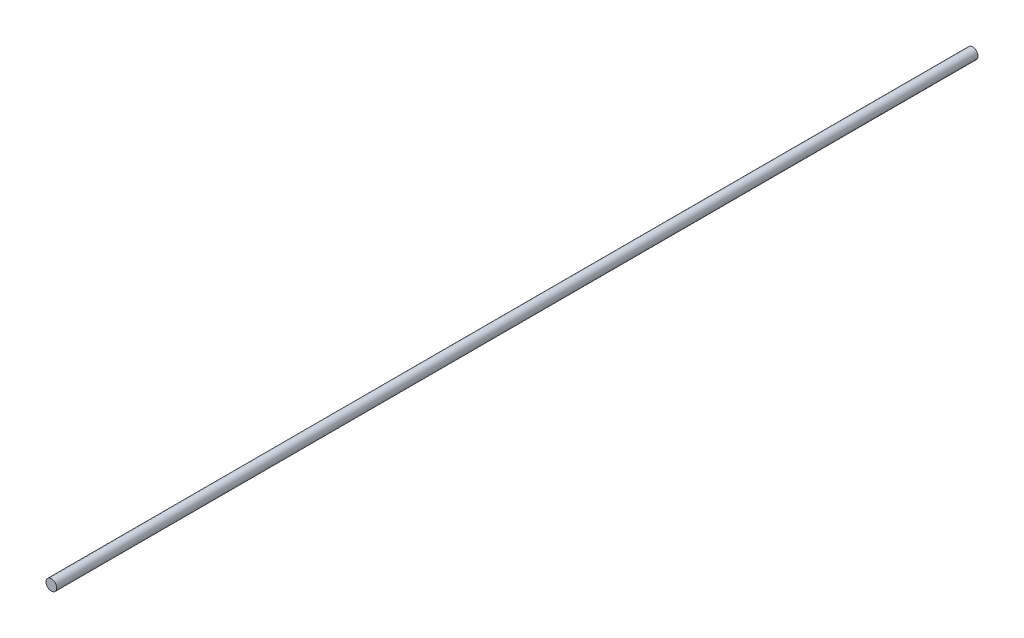
ISO-10303-21;
HEADER;
FILE_DESCRIPTION(('STEP AP214'),'2;1');
FILE_NAME('part.step','',(''),(''),'','','');
FILE_SCHEMA(('AUTOMOTIVE_DESIGN { 1 0 10303 214 1 1 1 1 }'));
ENDSEC;
DATA;
#1=APPLICATION_CONTEXT('core data for automotive mechanical design processes');
#2=APPLICATION_PROTOCOL_DEFINITION('international standard','automotive_design',2000,#1);
#3=PRODUCT_CONTEXT('',#1,'mechanical');
#4=PRODUCT('Part','Part','',(#3));
#5=PRODUCT_RELATED_PRODUCT_CATEGORY('part','',(#4));
#6=PRODUCT_DEFINITION_FORMATION('','',#4);
#7=PRODUCT_DEFINITION_CONTEXT('part definition',#1,'design');
#8=PRODUCT_DEFINITION('design','',#6,#7);
#9=PRODUCT_DEFINITION_SHAPE('','',#8);
#10=(LENGTH_UNIT() NAMED_UNIT(*) SI_UNIT(.MILLI.,.METRE.));
#11=(NAMED_UNIT(*) PLANE_ANGLE_UNIT() SI_UNIT($,.RADIAN.));
#12=(NAMED_UNIT(*) SI_UNIT($,.STERADIAN.) SOLID_ANGLE_UNIT());
#13=UNCERTAINTY_MEASURE_WITH_UNIT(LENGTH_MEASURE(1.E-05),#10,'distance_accuracy_value','');
#14=(GEOMETRIC_REPRESENTATION_CONTEXT(3) GLOBAL_UNCERTAINTY_ASSIGNED_CONTEXT((#13)) GLOBAL_UNIT_ASSIGNED_CONTEXT((#10,
#11,#12)) REPRESENTATION_CONTEXT('',''));
#15=CARTESIAN_POINT('',(0.,0.,0.));
#16=DIRECTION('',(0.,0.,1.));
#17=DIRECTION('',(1.,0.,0.));
#18=AXIS2_PLACEMENT_3D('',#15,#16,#17);
#19=CARTESIAN_POINT('',(0.,1.,3.));
#20=DIRECTION('',(0.,0.,-1.));
#21=DIRECTION('',(-1.,0.,0.));
#22=AXIS2_PLACEMENT_3D('',#19,#20,#21);
#23=CYLINDRICAL_SURFACE('',#22,0.5);
#24=CARTESIAN_POINT('',(0.,1.,3.));
#25=DIRECTION('',(0.,0.,1.));
#26=DIRECTION('',(1.,0.,0.));
#27=AXIS2_PLACEMENT_3D('',#24,#25,#26);
#28=CIRCLE('',#27,0.5);
#29=CARTESIAN_POINT('',(0.5,1.,3.));
#30=VERTEX_POINT('',#29);
#31=EDGE_CURVE('E10',#30,#30,#28,.T.);
#32=ORIENTED_EDGE('',*,*,#31,.F.);
#33=EDGE_LOOP('',(#32));
#34=FACE_BOUND('',#33,.T.);
#35=CARTESIAN_POINT('',(0.,1.,-83.));
#36=DIRECTION('',(0.,0.,1.));
#37=DIRECTION('',(1.,0.,0.));
#38=AXIS2_PLACEMENT_3D('',#35,#36,#37);
#39=CIRCLE('',#38,0.5);
#40=CARTESIAN_POINT('',(0.5,1.,-83.));
#41=VERTEX_POINT('',#40);
#42=EDGE_CURVE('E37',#41,#41,#39,.T.);
#43=ORIENTED_EDGE('',*,*,#42,.T.);
#44=EDGE_LOOP('',(#43));
#45=FACE_BOUND('',#44,.T.);
#46=ADVANCED_FACE('F31',(#34,#45),#23,.T.);
#47=CARTESIAN_POINT('',(0.,1.,3.));
#48=DIRECTION('',(0.,0.,1.));
#49=DIRECTION('',(1.,0.,0.));
#50=AXIS2_PLACEMENT_3D('',#47,#48,#49);
#51=PLANE('',#50);
#52=ORIENTED_EDGE('',*,*,#31,.T.);
#53=EDGE_LOOP('',(#52));
#54=FACE_BOUND('',#53,.T.);
#55=ADVANCED_FACE('F46',(#54),#51,.T.);
#56=CARTESIAN_POINT('',(0.,1.,-83.));
#57=DIRECTION('',(0.,0.,1.));
#58=DIRECTION('',(1.,0.,0.));
#59=AXIS2_PLACEMENT_3D('',#56,#57,#58);
#60=PLANE('',#59);
#61=ORIENTED_EDGE('',*,*,#42,.F.);
#62=EDGE_LOOP('',(#61));
#63=FACE_BOUND('',#62,.T.);
#64=ADVANCED_FACE('F44',(#63),#60,.F.);
#65=CLOSED_SHELL('',(#46,#55,#64));
#66=MANIFOLD_SOLID_BREP('B2',#65);
#67=ADVANCED_BREP_SHAPE_REPRESENTATION('',(#18,#66),#14);
#68=SHAPE_DEFINITION_REPRESENTATION(#9,#67);
ENDSEC;
END-ISO-10303-21;
